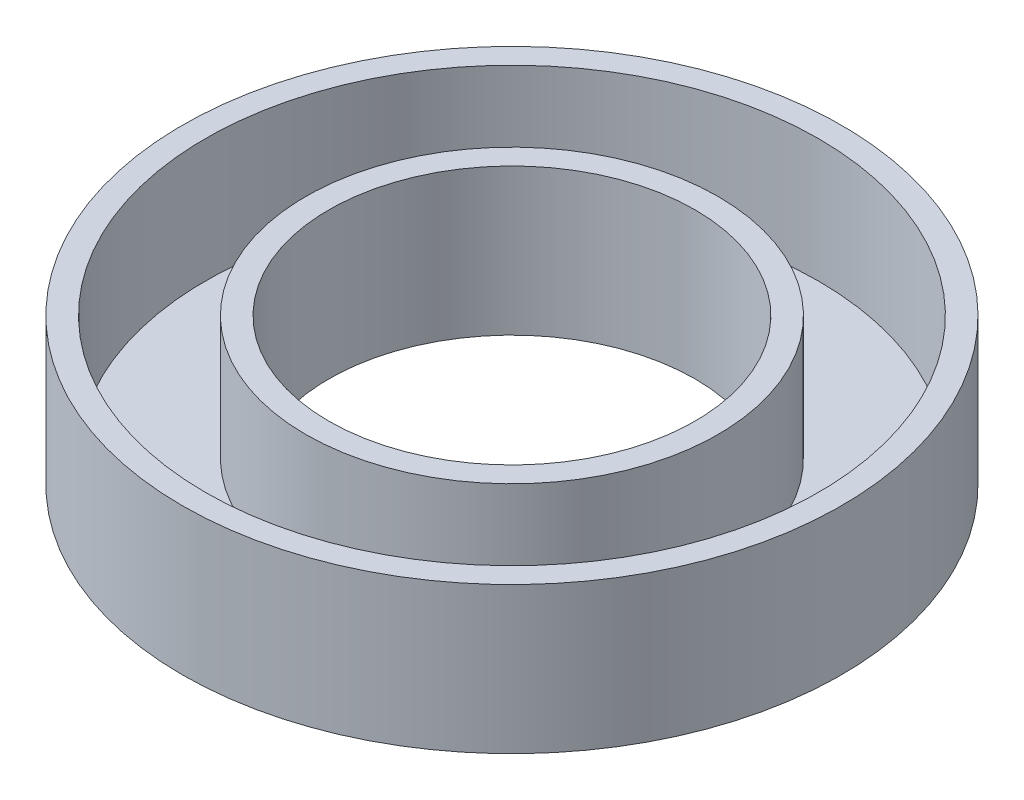
ISO-10303-21;
HEADER;
FILE_DESCRIPTION(('STEP AP214'),'2;1');
FILE_NAME('part.step','',(''),(''),'','','');
FILE_SCHEMA(('AUTOMOTIVE_DESIGN { 1 0 10303 214 1 1 1 1 }'));
ENDSEC;
DATA;
#1=APPLICATION_CONTEXT('core data for automotive mechanical design processes');
#2=APPLICATION_PROTOCOL_DEFINITION('international standard','automotive_design',2000,#1);
#3=PRODUCT_CONTEXT('',#1,'mechanical');
#4=PRODUCT('Part','Part','',(#3));
#5=PRODUCT_RELATED_PRODUCT_CATEGORY('part','',(#4));
#6=PRODUCT_DEFINITION_FORMATION('','',#4);
#7=PRODUCT_DEFINITION_CONTEXT('part definition',#1,'design');
#8=PRODUCT_DEFINITION('design','',#6,#7);
#9=PRODUCT_DEFINITION_SHAPE('','',#8);
#10=(LENGTH_UNIT() NAMED_UNIT(*) SI_UNIT(.MILLI.,.METRE.));
#11=(NAMED_UNIT(*) PLANE_ANGLE_UNIT() SI_UNIT($,.RADIAN.));
#12=(NAMED_UNIT(*) SI_UNIT($,.STERADIAN.) SOLID_ANGLE_UNIT());
#13=UNCERTAINTY_MEASURE_WITH_UNIT(LENGTH_MEASURE(1.E-05),#10,'distance_accuracy_value','');
#14=(GEOMETRIC_REPRESENTATION_CONTEXT(3) GLOBAL_UNCERTAINTY_ASSIGNED_CONTEXT((#13)) GLOBAL_UNIT_ASSIGNED_CONTEXT((#10,
#11,#12)) REPRESENTATION_CONTEXT('',''));
#15=CARTESIAN_POINT('',(0.,0.,0.));
#16=DIRECTION('',(0.,0.,1.));
#17=DIRECTION('',(1.,0.,0.));
#18=AXIS2_PLACEMENT_3D('',#15,#16,#17);
#19=CARTESIAN_POINT('',(0.,6.35,0.));
#20=DIRECTION('',(0.,1.,0.));
#21=DIRECTION('',(0.,0.,1.));
#22=AXIS2_PLACEMENT_3D('',#19,#20,#21);
#23=PLANE('',#22);
#24=CARTESIAN_POINT('',(0.,6.35,0.));
#25=DIRECTION('',(0.,1.,0.));
#26=DIRECTION('',(0.,0.,1.));
#27=AXIS2_PLACEMENT_3D('',#24,#25,#26);
#28=CIRCLE('',#27,7.9375);
#29=CARTESIAN_POINT('',(0.,6.35,7.9375));
#30=VERTEX_POINT('',#29);
#31=EDGE_CURVE('E45',#30,#30,#28,.T.);
#32=ORIENTED_EDGE('',*,*,#31,.F.);
#33=EDGE_LOOP('',(#32));
#34=FACE_BOUND('',#33,.T.);
#35=CARTESIAN_POINT('',(0.,6.35,0.));
#36=DIRECTION('',(0.,1.,0.));
#37=DIRECTION('',(0.,0.,1.));
#38=AXIS2_PLACEMENT_3D('',#35,#36,#37);
#39=CIRCLE('',#38,8.9375);
#40=CARTESIAN_POINT('',(0.,6.35,8.9375));
#41=VERTEX_POINT('',#40);
#42=EDGE_CURVE('E55',#41,#41,#39,.T.);
#43=ORIENTED_EDGE('',*,*,#42,.T.);
#44=EDGE_LOOP('',(#43));
#45=FACE_BOUND('',#44,.T.);
#46=ADVANCED_FACE('F31',(#34,#45),#23,.T.);
#47=CARTESIAN_POINT('',(0.,6.35,0.));
#48=DIRECTION('',(0.,-1.,0.));
#49=DIRECTION('',(0.,0.,-1.));
#50=AXIS2_PLACEMENT_3D('',#47,#48,#49);
#51=CYLINDRICAL_SURFACE('',#50,14.2875);
#52=CARTESIAN_POINT('',(0.,6.35,0.));
#53=DIRECTION('',(0.,1.,0.));
#54=DIRECTION('',(0.,0.,1.));
#55=AXIS2_PLACEMENT_3D('',#52,#53,#54);
#56=CIRCLE('',#55,14.2875);
#57=CARTESIAN_POINT('',(0.,6.35,14.2875));
#58=VERTEX_POINT('',#57);
#59=EDGE_CURVE('E10',#58,#58,#56,.T.);
#60=ORIENTED_EDGE('',*,*,#59,.F.);
#61=EDGE_LOOP('',(#60));
#62=FACE_BOUND('',#61,.T.);
#63=CARTESIAN_POINT('',(0.,0.,0.));
#64=DIRECTION('',(0.,1.,0.));
#65=DIRECTION('',(0.,0.,1.));
#66=AXIS2_PLACEMENT_3D('',#63,#64,#65);
#67=CIRCLE('',#66,14.2875);
#68=CARTESIAN_POINT('',(0.,0.,14.2875));
#69=VERTEX_POINT('',#68);
#70=EDGE_CURVE('E39',#69,#69,#67,.T.);
#71=ORIENTED_EDGE('',*,*,#70,.T.);
#72=EDGE_LOOP('',(#71));
#73=FACE_BOUND('',#72,.T.);
#74=ADVANCED_FACE('F33',(#62,#73),#51,.T.);
#75=CARTESIAN_POINT('',(0.,6.35,0.));
#76=DIRECTION('',(0.,1.,0.));
#77=DIRECTION('',(0.,0.,1.));
#78=AXIS2_PLACEMENT_3D('',#75,#76,#77);
#79=CIRCLE('',#78,13.2875);
#80=CARTESIAN_POINT('',(0.,6.35,13.2875));
#81=VERTEX_POINT('',#80);
#82=EDGE_CURVE('E49',#81,#81,#79,.T.);
#83=ORIENTED_EDGE('',*,*,#82,.F.);
#84=EDGE_LOOP('',(#83));
#85=FACE_BOUND('',#84,.T.);
#86=ORIENTED_EDGE('',*,*,#59,.T.);
#87=EDGE_LOOP('',(#86));
#88=FACE_BOUND('',#87,.T.);
#89=ADVANCED_FACE('F77',(#85,#88),#23,.T.);
#90=CARTESIAN_POINT('',(0.,0.,0.));
#91=DIRECTION('',(0.,1.,0.));
#92=DIRECTION('',(0.,0.,1.));
#93=AXIS2_PLACEMENT_3D('',#90,#91,#92);
#94=PLANE('',#93);
#95=CARTESIAN_POINT('',(0.,0.,0.));
#96=DIRECTION('',(0.,1.,0.));
#97=DIRECTION('',(0.,0.,1.));
#98=AXIS2_PLACEMENT_3D('',#95,#96,#97);
#99=CIRCLE('',#98,7.9375);
#100=CARTESIAN_POINT('',(0.,0.,7.9375));
#101=VERTEX_POINT('',#100);
#102=EDGE_CURVE('E35',#101,#101,#99,.T.);
#103=ORIENTED_EDGE('',*,*,#102,.T.);
#104=EDGE_LOOP('',(#103));
#105=FACE_BOUND('',#104,.T.);
#106=ORIENTED_EDGE('',*,*,#70,.F.);
#107=EDGE_LOOP('',(#106));
#108=FACE_BOUND('',#107,.T.);
#109=ADVANCED_FACE('F79',(#105,#108),#94,.F.);
#110=CARTESIAN_POINT('',(0.,-13.65,0.));
#111=DIRECTION('',(0.,1.,0.));
#112=DIRECTION('',(0.,0.,1.));
#113=AXIS2_PLACEMENT_3D('',#110,#111,#112);
#114=CYLINDRICAL_SURFACE('',#113,7.9375);
#115=ORIENTED_EDGE('',*,*,#31,.T.);
#116=EDGE_LOOP('',(#115));
#117=FACE_BOUND('',#116,.T.);
#118=ORIENTED_EDGE('',*,*,#102,.F.);
#119=EDGE_LOOP('',(#118));
#120=FACE_BOUND('',#119,.T.);
#121=ADVANCED_FACE('F73',(#117,#120),#114,.F.);
#122=CARTESIAN_POINT('',(0.,1.,0.));
#123=DIRECTION('',(0.,1.,0.));
#124=DIRECTION('',(0.,0.,1.));
#125=AXIS2_PLACEMENT_3D('',#122,#123,#124);
#126=CYLINDRICAL_SURFACE('',#125,13.2875);
#127=CARTESIAN_POINT('',(0.,1.,0.));
#128=DIRECTION('',(0.,1.,0.));
#129=DIRECTION('',(0.,0.,1.));
#130=AXIS2_PLACEMENT_3D('',#127,#128,#129);
#131=CIRCLE('',#130,13.2875);
#132=CARTESIAN_POINT('',(0.,1.,13.2875));
#133=VERTEX_POINT('',#132);
#134=EDGE_CURVE('E48',#133,#133,#131,.T.);
#135=ORIENTED_EDGE('',*,*,#134,.F.);
#136=EDGE_LOOP('',(#135));
#137=FACE_BOUND('',#136,.T.);
#138=ORIENTED_EDGE('',*,*,#82,.T.);
#139=EDGE_LOOP('',(#138));
#140=FACE_BOUND('',#139,.T.);
#141=ADVANCED_FACE('F67',(#137,#140),#126,.F.);
#142=CARTESIAN_POINT('',(0.,1.,0.));
#143=DIRECTION('',(0.,1.,0.));
#144=DIRECTION('',(0.,0.,1.));
#145=AXIS2_PLACEMENT_3D('',#142,#143,#144);
#146=PLANE('',#145);
#147=CARTESIAN_POINT('',(0.,1.,0.));
#148=DIRECTION('',(0.,1.,0.));
#149=DIRECTION('',(0.,0.,1.));
#150=AXIS2_PLACEMENT_3D('',#147,#148,#149);
#151=CIRCLE('',#150,8.9375);
#152=CARTESIAN_POINT('',(0.,1.,8.9375));
#153=VERTEX_POINT('',#152);
#154=EDGE_CURVE('E52',#153,#153,#151,.T.);
#155=ORIENTED_EDGE('',*,*,#154,.F.);
#156=EDGE_LOOP('',(#155));
#157=FACE_BOUND('',#156,.T.);
#158=ORIENTED_EDGE('',*,*,#134,.T.);
#159=EDGE_LOOP('',(#158));
#160=FACE_BOUND('',#159,.T.);
#161=ADVANCED_FACE('F64',(#157,#160),#146,.T.);
#162=CARTESIAN_POINT('',(0.,1.,0.));
#163=DIRECTION('',(0.,1.,0.));
#164=DIRECTION('',(0.,0.,1.));
#165=AXIS2_PLACEMENT_3D('',#162,#163,#164);
#166=CYLINDRICAL_SURFACE('',#165,8.9375);
#167=ORIENTED_EDGE('',*,*,#154,.T.);
#168=EDGE_LOOP('',(#167));
#169=FACE_BOUND('',#168,.T.);
#170=ORIENTED_EDGE('',*,*,#42,.F.);
#171=EDGE_LOOP('',(#170));
#172=FACE_BOUND('',#171,.T.);
#173=ADVANCED_FACE('F61',(#169,#172),#166,.T.);
#174=CLOSED_SHELL('',(#46,#74,#89,#109,#121,#141,#161,#173));
#175=MANIFOLD_SOLID_BREP('B2',#174);
#176=ADVANCED_BREP_SHAPE_REPRESENTATION('',(#18,#175),#14);
#177=SHAPE_DEFINITION_REPRESENTATION(#9,#176);
ENDSEC;
END-ISO-10303-21;
